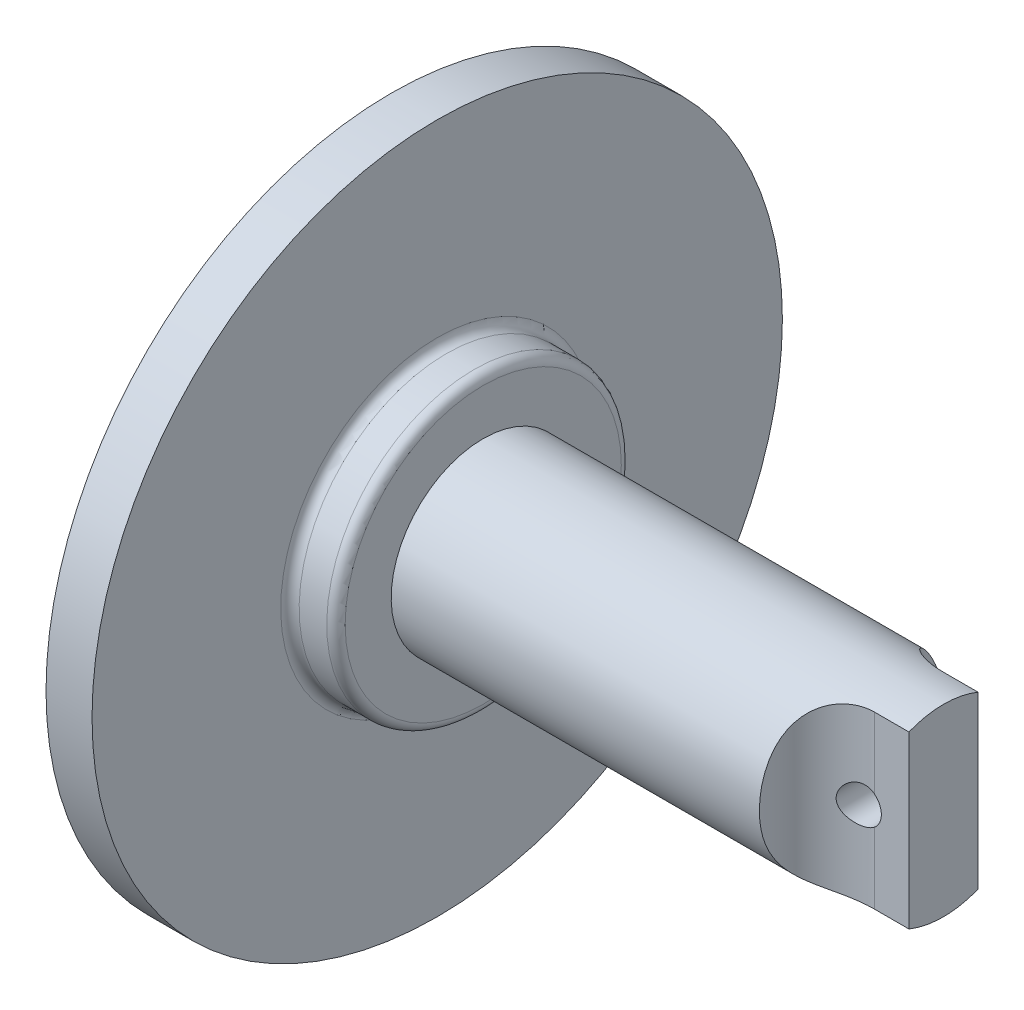
ISO-10303-21;
HEADER;
FILE_DESCRIPTION(('STEP AP214'),'2;1');
FILE_NAME('part.step','',(''),(''),'','','');
FILE_SCHEMA(('AUTOMOTIVE_DESIGN { 1 0 10303 214 1 1 1 1 }'));
ENDSEC;
DATA;
#1=APPLICATION_CONTEXT('core data for automotive mechanical design processes');
#2=APPLICATION_PROTOCOL_DEFINITION('international standard','automotive_design',2000,#1);
#3=PRODUCT_CONTEXT('',#1,'mechanical');
#4=PRODUCT('Part','Part','',(#3));
#5=PRODUCT_RELATED_PRODUCT_CATEGORY('part','',(#4));
#6=PRODUCT_DEFINITION_FORMATION('','',#4);
#7=PRODUCT_DEFINITION_CONTEXT('part definition',#1,'design');
#8=PRODUCT_DEFINITION('design','',#6,#7);
#9=PRODUCT_DEFINITION_SHAPE('','',#8);
#10=(LENGTH_UNIT() NAMED_UNIT(*) SI_UNIT(.MILLI.,.METRE.));
#11=(NAMED_UNIT(*) PLANE_ANGLE_UNIT() SI_UNIT($,.RADIAN.));
#12=(NAMED_UNIT(*) SI_UNIT($,.STERADIAN.) SOLID_ANGLE_UNIT());
#13=UNCERTAINTY_MEASURE_WITH_UNIT(LENGTH_MEASURE(1.E-05),#10,'distance_accuracy_value','');
#14=(GEOMETRIC_REPRESENTATION_CONTEXT(3) GLOBAL_UNCERTAINTY_ASSIGNED_CONTEXT((#13)) GLOBAL_UNIT_ASSIGNED_CONTEXT((#10,
#11,#12)) REPRESENTATION_CONTEXT('',''));
#15=CARTESIAN_POINT('',(0.,0.,0.));
#16=DIRECTION('',(0.,0.,1.));
#17=DIRECTION('',(1.,0.,0.));
#18=AXIS2_PLACEMENT_3D('',#15,#16,#17);
#19=CARTESIAN_POINT('',(0.,0.,0.));
#20=DIRECTION('',(-1.,0.,0.));
#21=DIRECTION('',(0.,-1.,0.));
#22=AXIS2_PLACEMENT_3D('',#19,#20,#21);
#23=PLANE('',#22);
#24=CARTESIAN_POINT('',(0.,0.,0.));
#25=DIRECTION('',(1.,0.,0.));
#26=DIRECTION('',(0.,1.,0.));
#27=AXIS2_PLACEMENT_3D('',#24,#25,#26);
#28=CIRCLE('',#27,75.);
#29=CARTESIAN_POINT('',(0.,75.,0.));
#30=VERTEX_POINT('',#29);
#31=EDGE_CURVE('E184',#30,#30,#28,.T.);
#32=ORIENTED_EDGE('',*,*,#31,.F.);
#33=EDGE_LOOP('',(#32));
#34=FACE_BOUND('',#33,.T.);
#35=ADVANCED_FACE('F34',(#34),#23,.T.);
#36=CARTESIAN_POINT('',(120.,0.,0.));
#37=DIRECTION('',(1.,0.,0.));
#38=DIRECTION('',(0.,1.,0.));
#39=AXIS2_PLACEMENT_3D('',#36,#37,#38);
#40=CYLINDRICAL_SURFACE('',#39,75.);
#41=ORIENTED_EDGE('',*,*,#31,.T.);
#42=EDGE_LOOP('',(#41));
#43=FACE_BOUND('',#42,.T.);
#44=CARTESIAN_POINT('',(10.,0.,0.));
#45=DIRECTION('',(1.,0.,0.));
#46=DIRECTION('',(0.,1.,0.));
#47=AXIS2_PLACEMENT_3D('',#44,#45,#46);
#48=CIRCLE('',#47,75.);
#49=CARTESIAN_POINT('',(10.,75.,0.));
#50=VERTEX_POINT('',#49);
#51=EDGE_CURVE('E182',#50,#50,#48,.T.);
#52=ORIENTED_EDGE('',*,*,#51,.F.);
#53=EDGE_LOOP('',(#52));
#54=FACE_BOUND('',#53,.T.);
#55=ADVANCED_FACE('F220',(#43,#54),#40,.T.);
#56=CARTESIAN_POINT('',(10.,75.,0.));
#57=DIRECTION('',(1.,0.,0.));
#58=DIRECTION('',(0.,1.,0.));
#59=AXIS2_PLACEMENT_3D('',#56,#57,#58);
#60=PLANE('',#59);
#61=ORIENTED_EDGE('',*,*,#51,.T.);
#62=EDGE_LOOP('',(#61));
#63=FACE_BOUND('',#62,.T.);
#64=CARTESIAN_POINT('',(10.,0.,0.));
#65=DIRECTION('',(1.,0.,0.));
#66=DIRECTION('',(0.,1.,0.));
#67=AXIS2_PLACEMENT_3D('',#64,#65,#66);
#68=CIRCLE('',#67,34.);
#69=CARTESIAN_POINT('',(10.,34.,0.));
#70=VERTEX_POINT('',#69);
#71=EDGE_CURVE('E179',#70,#70,#68,.T.);
#72=ORIENTED_EDGE('',*,*,#71,.F.);
#73=EDGE_LOOP('',(#72));
#74=FACE_BOUND('',#73,.T.);
#75=ADVANCED_FACE('F225',(#63,#74),#60,.T.);
#76=CARTESIAN_POINT('',(12.,0.,0.));
#77=DIRECTION('',(1.,0.,0.));
#78=DIRECTION('',(0.,1.,0.));
#79=AXIS2_PLACEMENT_3D('',#76,#77,#78);
#80=TOROIDAL_SURFACE('',#79,34.,2.);
#81=ORIENTED_EDGE('',*,*,#71,.T.);
#82=EDGE_LOOP('',(#81));
#83=FACE_BOUND('',#82,.T.);
#84=CARTESIAN_POINT('',(12.,0.,0.));
#85=DIRECTION('',(1.,0.,0.));
#86=DIRECTION('',(0.,1.,0.));
#87=AXIS2_PLACEMENT_3D('',#84,#85,#86);
#88=CIRCLE('',#87,32.);
#89=CARTESIAN_POINT('',(12.,32.,0.));
#90=VERTEX_POINT('',#89);
#91=EDGE_CURVE('E176',#90,#90,#88,.T.);
#92=ORIENTED_EDGE('',*,*,#91,.F.);
#93=EDGE_LOOP('',(#92));
#94=FACE_BOUND('',#93,.T.);
#95=ADVANCED_FACE('F230',(#83,#94),#80,.F.);
#96=CARTESIAN_POINT('',(120.,0.,0.));
#97=DIRECTION('',(1.,0.,0.));
#98=DIRECTION('',(0.,1.,0.));
#99=AXIS2_PLACEMENT_3D('',#96,#97,#98);
#100=CYLINDRICAL_SURFACE('',#99,32.);
#101=ORIENTED_EDGE('',*,*,#91,.T.);
#102=EDGE_LOOP('',(#101));
#103=FACE_BOUND('',#102,.T.);
#104=CARTESIAN_POINT('',(18.,0.,0.));
#105=DIRECTION('',(1.,0.,0.));
#106=DIRECTION('',(0.,1.,0.));
#107=AXIS2_PLACEMENT_3D('',#104,#105,#106);
#108=CIRCLE('',#107,32.);
#109=CARTESIAN_POINT('',(18.,32.,0.));
#110=VERTEX_POINT('',#109);
#111=EDGE_CURVE('E173',#110,#110,#108,.T.);
#112=ORIENTED_EDGE('',*,*,#111,.F.);
#113=EDGE_LOOP('',(#112));
#114=FACE_BOUND('',#113,.T.);
#115=ADVANCED_FACE('F234',(#103,#114),#100,.T.);
#116=CARTESIAN_POINT('',(18.,0.,0.));
#117=DIRECTION('',(1.,0.,0.));
#118=DIRECTION('',(0.,1.,0.));
#119=AXIS2_PLACEMENT_3D('',#116,#117,#118);
#120=TOROIDAL_SURFACE('',#119,30.,2.);
#121=ORIENTED_EDGE('',*,*,#111,.T.);
#122=EDGE_LOOP('',(#121));
#123=FACE_BOUND('',#122,.T.);
#124=CARTESIAN_POINT('',(20.,0.,0.));
#125=DIRECTION('',(1.,0.,0.));
#126=DIRECTION('',(0.,1.,0.));
#127=AXIS2_PLACEMENT_3D('',#124,#125,#126);
#128=CIRCLE('',#127,30.);
#129=CARTESIAN_POINT('',(20.,30.,0.));
#130=VERTEX_POINT('',#129);
#131=EDGE_CURVE('E170',#130,#130,#128,.T.);
#132=ORIENTED_EDGE('',*,*,#131,.F.);
#133=EDGE_LOOP('',(#132));
#134=FACE_BOUND('',#133,.T.);
#135=ADVANCED_FACE('F237',(#123,#134),#120,.T.);
#136=CARTESIAN_POINT('',(20.,30.,0.));
#137=DIRECTION('',(1.,0.,0.));
#138=DIRECTION('',(0.,1.,0.));
#139=AXIS2_PLACEMENT_3D('',#136,#137,#138);
#140=PLANE('',#139);
#141=ORIENTED_EDGE('',*,*,#131,.T.);
#142=EDGE_LOOP('',(#141));
#143=FACE_BOUND('',#142,.T.);
#144=CARTESIAN_POINT('',(20.,0.,0.));
#145=DIRECTION('',(1.,0.,0.));
#146=DIRECTION('',(0.,1.,0.));
#147=AXIS2_PLACEMENT_3D('',#144,#145,#146);
#148=CIRCLE('',#147,20.);
#149=CARTESIAN_POINT('',(20.,20.,0.));
#150=VERTEX_POINT('',#149);
#151=EDGE_CURVE('E167',#150,#150,#148,.T.);
#152=ORIENTED_EDGE('',*,*,#151,.F.);
#153=EDGE_LOOP('',(#152));
#154=FACE_BOUND('',#153,.T.);
#155=ADVANCED_FACE('F136',(#143,#154),#140,.T.);
#156=CARTESIAN_POINT('',(120.,0.,0.));
#157=DIRECTION('',(1.,0.,0.));
#158=DIRECTION('',(0.,1.,0.));
#159=AXIS2_PLACEMENT_3D('',#156,#157,#158);
#160=CYLINDRICAL_SURFACE('',#159,20.);
#161=DIRECTION('',(1.,0.,0.));
#162=VECTOR('',#161,1.);
#163=CARTESIAN_POINT('',(100.,18.5404962177392,-7.5));
#164=LINE('',#163,#162);
#165=CARTESIAN_POINT('',(112.5,18.5404962177392,-7.5));
#166=VERTEX_POINT('',#165);
#167=CARTESIAN_POINT('',(120.,18.5404962177392,-7.5));
#168=VERTEX_POINT('',#167);
#169=EDGE_CURVE('E193',#166,#168,#164,.T.);
#170=ORIENTED_EDGE('',*,*,#169,.F.);
#171=CARTESIAN_POINT('',(112.5,18.5404962177392,-7.5));
#172=CARTESIAN_POINT('',(112.338956906171,18.5404935091154,-7.49999955027861));
#173=CARTESIAN_POINT('',(112.177932926346,18.5392374224213,-7.50311275273671));
#174=CARTESIAN_POINT('',(111.856167945249,18.5341986988898,-7.51555343832526));
#175=CARTESIAN_POINT('',(111.695426938582,18.53041611075,-7.52488080167958));
#176=CARTESIAN_POINT('',(111.214041205506,18.5152505660081,-7.56216051678758));
#177=CARTESIAN_POINT('',(110.894178375248,18.5000498415969,-7.5994105026875));
#178=CARTESIAN_POINT('',(110.258870229306,18.4590995969255,-7.6983433444966));
#179=CARTESIAN_POINT('',(109.943426376855,18.4333466641446,-7.76003410419078));
#180=CARTESIAN_POINT('',(109.319261373974,18.3706968077058,-7.9072050956589));
#181=CARTESIAN_POINT('',(109.010540014746,18.3338002306962,-7.99268458742403));
#182=CARTESIAN_POINT('',(108.401711680526,18.2480323342663,-8.18660854241349));
#183=CARTESIAN_POINT('',(108.101614800974,18.1991475726731,-8.29507876614651));
#184=CARTESIAN_POINT('',(107.512608040262,18.0885009505557,-8.53366345343799));
#185=CARTESIAN_POINT('',(107.223697897931,18.0267393908767,-8.66377741131189));
#186=CARTESIAN_POINT('',(106.659423660512,17.8893967253437,-8.94392449788416));
#187=CARTESIAN_POINT('',(106.384048770448,17.8138268668637,-9.09394138785777));
#188=CARTESIAN_POINT('',(105.848603776823,17.6478479012738,-9.41199340749333));
#189=CARTESIAN_POINT('',(105.58853329675,17.5574391594321,-9.58002809360115));
#190=CARTESIAN_POINT('',(105.08954204536,17.3624732050346,-9.92893732283396));
#191=CARTESIAN_POINT('',(104.850348448148,17.258166855298,-10.1095619756672));
#192=CARTESIAN_POINT('',(104.389964426535,17.0336543440187,-10.4834222384663));
#193=CARTESIAN_POINT('',(104.168773689014,16.9134484591097,-10.6766576289901));
#194=CARTESIAN_POINT('',(103.745476943824,16.6567016948116,-11.0729404969896));
#195=CARTESIAN_POINT('',(103.543371748361,16.5201601207996,-11.2759883914916));
#196=CARTESIAN_POINT('',(103.158928663785,16.2306073793557,-11.6889245880329));
#197=CARTESIAN_POINT('',(102.976590960287,16.0775960573013,-11.8988129542795));
#198=CARTESIAN_POINT('',(102.63241143685,15.7557535905378,-12.3217950249763));
#199=CARTESIAN_POINT('',(102.470510451821,15.586970694837,-12.5348773809344));
#200=CARTESIAN_POINT('',(102.16633432225,15.2336653435132,-12.9619536808703));
#201=CARTESIAN_POINT('',(102.024058686949,15.0491432816577,-13.1759476019152));
#202=CARTESIAN_POINT('',(101.758442311996,14.6650205230174,-13.6021865636069));
#203=CARTESIAN_POINT('',(101.635104425719,14.4654175607206,-13.8144313361572));
#204=CARTESIAN_POINT('',(101.406350945564,14.0520159789684,-14.2347394953688));
#205=CARTESIAN_POINT('',(101.300938833632,13.8382146127706,-14.4428020627636));
#206=CARTESIAN_POINT('',(101.072966026936,13.3206692533851,-14.9239461252854));
#207=CARTESIAN_POINT('',(100.957203480499,13.0115174546629,-15.1944569601378));
#208=CARTESIAN_POINT('',(100.752274769999,12.3717777884061,-15.7197521143397));
#209=CARTESIAN_POINT('',(100.663116339425,12.0411837217996,-15.9745318438152));
#210=CARTESIAN_POINT('',(100.507319607566,11.3605044367909,-16.465582089206));
#211=CARTESIAN_POINT('',(100.440725701048,11.010382355122,-16.7018154226786));
#212=CARTESIAN_POINT('',(100.326354155674,10.2937035571413,-17.1528138537932));
#213=CARTESIAN_POINT('',(100.278576931776,9.92714647859237,-17.3675784779151));
#214=CARTESIAN_POINT('',(100.187871699835,9.0851446956119,-17.8253801459362));
#215=CARTESIAN_POINT('',(100.149235412189,8.60563205738617,-18.0618046894832));
#216=CARTESIAN_POINT('',(100.088895458415,7.62824928216758,-18.49583605447));
#217=CARTESIAN_POINT('',(100.067197011256,7.13037353649362,-18.6934308974938));
#218=CARTESIAN_POINT('',(100.035028360561,6.12025347659782,-19.0480699174889));
#219=CARTESIAN_POINT('',(100.024554543863,5.60801384056866,-19.2051271309896));
#220=CARTESIAN_POINT('',(100.01017315587,4.57264301175203,-19.4776109589941));
#221=CARTESIAN_POINT('',(100.006263240276,4.04951577508557,-19.5930524250128));
#222=CARTESIAN_POINT('',(100.002612702569,3.23180607381896,-19.7393727233925));
#223=CARTESIAN_POINT('',(100.001789105047,2.93978162092925,-19.7849697937345));
#224=CARTESIAN_POINT('',(100.00068704985,2.3540412350955,-19.8631756809714));
#225=CARTESIAN_POINT('',(100.000408478805,2.06032566667149,-19.8957871978654));
#226=CARTESIAN_POINT('',(100.000080218915,1.47249105338509,-19.9478974534955));
#227=CARTESIAN_POINT('',(100.000029949875,1.17837493354535,-19.9674293241835));
#228=CARTESIAN_POINT('',(100.000000606662,0.589506838491083,-19.9934840044796));
#229=CARTESIAN_POINT('',(100.000021547041,0.294754745599151,-20.0000041543067));
#230=CARTESIAN_POINT('',(100.,0.,-20.));
#231=B_SPLINE_CURVE_WITH_KNOTS('',3,(#171,#172,#173,#174,#175,#176,#177,#178,#179,#180,#181,
#182,#183,#184,#185,#186,#187,#188,#189,#190,#191,#192,#193,#194,#195,#196,#197,#198,#199,#200,
#201,#202,#203,#204,#205,#206,#207,#208,#209,#210,#211,#212,#213,#214,#215,#216,#217,#218,#219,
#220,#221,#222,#223,#224,#225,#226,#227,#228,#229,#230),.UNSPECIFIED.,.F.,.F.,(4,2,2,2,2,2,2,2,
2,2,2,2,2,2,2,2,2,2,2,2,2,2,2,2,2,2,2,2,2,4),(0.,0.483056064645852,0.966102818797453,
1.93203067697302,2.8982711572464,3.86448158351978,4.83178040094929,5.79905662156657,
6.76554844370495,7.73201647863532,8.68294491185735,9.63385680219386,10.584809141404,
11.5357704091961,12.483912186141,13.4320302491328,14.3802910264151,15.3287357862447,
16.6072397737458,17.8861150453493,19.1674920363011,20.4488972834522,22.0547935887148,
23.6611845153705,25.2670581959749,26.8723582157993,27.7588025105291,28.6450623964706,
29.5290687254007,30.4132557393009),.UNSPECIFIED.);
#232=CARTESIAN_POINT('',(100.,0.,-20.));
#233=VERTEX_POINT('',#232);
#234=EDGE_CURVE('E122',#166,#233,#231,.T.);
#235=ORIENTED_EDGE('',*,*,#234,.T.);
#236=CARTESIAN_POINT('',(100.,0.,-20.));
#237=CARTESIAN_POINT('',(100.000013797503,-0.263959994965488,-20.0000025912812));
#238=CARTESIAN_POINT('',(100.00000035709,-0.527917780855497,-19.9947743722892));
#239=CARTESIAN_POINT('',(100.000019298366,-1.05541873460449,-19.9738764115313));
#240=CARTESIAN_POINT('',(100.000051679885,-1.31896190399458,-19.9582067084153));
#241=CARTESIAN_POINT('',(100.000262563184,-1.84522939558049,-19.9164455586537));
#242=CARTESIAN_POINT('',(100.00044106719,-2.1079537052346,-19.8903539531683));
#243=CARTESIAN_POINT('',(100.001147771822,-2.63214767789347,-19.8277960399741));
#244=CARTESIAN_POINT('',(100.001675973136,-2.89361733842707,-19.7913297118396));
#245=CARTESIAN_POINT('',(100.004178156857,-3.67910134172827,-19.6658721356812));
#246=CARTESIAN_POINT('',(100.007074793725,-4.2006887672358,-19.5610995647389));
#247=CARTESIAN_POINT('',(100.01840969438,-5.23375075313772,-19.3103726345516));
#248=CARTESIAN_POINT('',(100.026848045665,-5.74522515372674,-19.1644176251));
#249=CARTESIAN_POINT('',(100.054343593337,-6.78498937818303,-18.822352686095));
#250=CARTESIAN_POINT('',(100.074006172764,-7.31245316173661,-18.6237635554209));
#251=CARTESIAN_POINT('',(100.130750610815,-8.34808369997794,-18.1831323370909));
#252=CARTESIAN_POINT('',(100.167835870034,-8.85624666655375,-17.9410817722405));
#253=CARTESIAN_POINT('',(100.266882824873,-9.84676485885715,-17.41704837384));
#254=CARTESIAN_POINT('',(100.328748263516,-10.3292118538381,-17.13522275603));
#255=CARTESIAN_POINT('',(100.446523793677,-11.0308809337056,-16.6852341110605));
#256=CARTESIAN_POINT('',(100.489939742635,-11.2610823279609,-16.5307126055573));
#257=CARTESIAN_POINT('',(100.586226745268,-11.7135431460163,-16.2132423227072));
#258=CARTESIAN_POINT('',(100.639096558144,-11.9358036074594,-16.0502946532687));
#259=CARTESIAN_POINT('',(100.773164852368,-12.4381614909897,-15.6658967476971));
#260=CARTESIAN_POINT('',(100.858085758998,-12.715231259584,-15.4417573051675));
#261=CARTESIAN_POINT('',(101.048381811694,-13.2529266177377,-14.9828179009289));
#262=CARTESIAN_POINT('',(101.153750876581,-13.5135570658084,-14.7480211245222));
#263=CARTESIAN_POINT('',(101.387167320532,-14.0167332837077,-14.2706472343811));
#264=CARTESIAN_POINT('',(101.515203742604,-14.2592877110252,-14.0280739258681));
#265=CARTESIAN_POINT('',(101.795883679824,-14.7249526777666,-13.5384602974642));
#266=CARTESIAN_POINT('',(101.948527812997,-14.9480627286257,-13.2914198655192));
#267=CARTESIAN_POINT('',(102.281077750524,-15.3752673078448,-12.7948919108993));
#268=CARTESIAN_POINT('',(102.461189432989,-15.579197655327,-12.5454004761948));
#269=CARTESIAN_POINT('',(102.848430503902,-15.9651506877169,-12.0504139568275));
#270=CARTESIAN_POINT('',(103.055560145682,-16.1471731671764,-11.8049189096608));
#271=CARTESIAN_POINT('',(103.496591396988,-16.4888920842588,-11.3227105601211));
#272=CARTESIAN_POINT('',(103.730485963563,-16.6485943707815,-11.0859949691228));
#273=CARTESIAN_POINT('',(104.224055136656,-16.9459096829754,-10.6259671122411));
#274=CARTESIAN_POINT('',(104.483726818057,-17.0835252103629,-10.4026533301621));
#275=CARTESIAN_POINT('',(104.993778973886,-17.3218598642165,-10.0000522104852));
#276=CARTESIAN_POINT('',(105.241409100647,-17.4250332245684,-9.81872113138888));
#277=CARTESIAN_POINT('',(105.753528529321,-17.6157026538585,-9.47238638216087));
#278=CARTESIAN_POINT('',(106.018016481968,-17.703199975344,-9.30738140801238));
#279=CARTESIAN_POINT('',(106.562102391298,-17.863483990226,-8.99592407812314));
#280=CARTESIAN_POINT('',(106.841706842754,-17.9362642957962,-8.84947978877685));
#281=CARTESIAN_POINT('',(107.413856876124,-18.0680772475029,-8.57714897427724));
#282=CARTESIAN_POINT('',(107.706402179412,-18.1271101894592,-8.451262006783));
#283=CARTESIAN_POINT('',(108.294897861687,-18.2311266919519,-8.22442749252778));
#284=CARTESIAN_POINT('',(108.590586044562,-18.2764210146429,-8.12294115166201));
#285=CARTESIAN_POINT('',(109.190167186419,-18.3557315448657,-7.94209538297587));
#286=CARTESIAN_POINT('',(109.494061089491,-18.3897464486392,-7.86273851321117));
#287=CARTESIAN_POINT('',(110.107407235593,-18.4471488260637,-7.72710261918502));
#288=CARTESIAN_POINT('',(110.416849733428,-18.470553335453,-7.67078661546659));
#289=CARTESIAN_POINT('',(111.039562149123,-18.5073299054185,-7.58162798072792));
#290=CARTESIAN_POINT('',(111.352829975712,-18.5207072183469,-7.54877306097011));
#291=CARTESIAN_POINT('',(111.805646829028,-18.532993801756,-7.51852480805441));
#292=CARTESIAN_POINT('',(111.944516975614,-18.5358108310181,-7.51157425852859));
#293=CARTESIAN_POINT('',(112.222253043711,-18.539560079151,-7.5023150426614));
#294=CARTESIAN_POINT('',(112.36111872681,-18.5404947915167,-7.50000023539993));
#295=CARTESIAN_POINT('',(112.5,-18.5404962177391,-7.5));
#296=B_SPLINE_CURVE_WITH_KNOTS('',3,(#236,#237,#238,#239,#240,#241,#242,#243,#244,#245,#246,
#247,#248,#249,#250,#251,#252,#253,#254,#255,#256,#257,#258,#259,#260,#261,#262,#263,#264,#265,
#266,#267,#268,#269,#270,#271,#272,#273,#274,#275,#276,#277,#278,#279,#280,#281,#282,#283,#284,
#285,#286,#287,#288,#289,#290,#291,#292,#293,#294,#295),.UNSPECIFIED.,.F.,.F.,(4,2,2,2,2,2,2,2,
2,2,2,2,2,2,2,2,2,2,2,2,2,2,2,2,2,2,2,2,2,4),(0.,0.791823905445691,1.58364487991398,
2.37547792295786,3.16731252496731,4.76149073414678,6.35569411432771,8.04532243348251,
9.73528067498593,11.4187370771249,12.2603010015413,13.1017545534664,14.19976641651,
15.2974522354423,16.3946088944185,17.4917931129098,18.5976467393321,19.7035107354512,
20.8090843996713,21.9145327495951,22.8847301915757,23.854850078206,24.8253901395612,
25.7959093146275,26.7424777735469,27.68915560571,28.6343080493379,29.5789650654317,
29.9961082194406,30.4126984217148),.UNSPECIFIED.);
#297=CARTESIAN_POINT('',(112.5,-18.5404962177391,-7.5));
#298=VERTEX_POINT('',#297);
#299=EDGE_CURVE('E111',#233,#298,#296,.T.);
#300=ORIENTED_EDGE('',*,*,#299,.T.);
#301=DIRECTION('',(1.,0.,0.));
#302=VECTOR('',#301,1.);
#303=CARTESIAN_POINT('',(100.,-18.5404962177391,-7.5));
#304=LINE('',#303,#302);
#305=CARTESIAN_POINT('',(120.,-18.5404962177391,-7.5));
#306=VERTEX_POINT('',#305);
#307=EDGE_CURVE('E163',#298,#306,#304,.T.);
#308=ORIENTED_EDGE('',*,*,#307,.T.);
#309=CARTESIAN_POINT('',(120.,0.,0.));
#310=DIRECTION('',(1.,0.,0.));
#311=DIRECTION('',(0.,1.,0.));
#312=AXIS2_PLACEMENT_3D('',#309,#310,#311);
#313=CIRCLE('',#312,20.);
#314=CARTESIAN_POINT('',(120.,-18.5404962177391,7.5));
#315=VERTEX_POINT('',#314);
#316=EDGE_CURVE('E155',#315,#306,#313,.T.);
#317=ORIENTED_EDGE('',*,*,#316,.F.);
#318=DIRECTION('',(1.,0.,0.));
#319=VECTOR('',#318,1.);
#320=CARTESIAN_POINT('',(100.,-18.5404962177391,7.5));
#321=LINE('',#320,#319);
#322=CARTESIAN_POINT('',(112.5,-18.5404962177391,7.5));
#323=VERTEX_POINT('',#322);
#324=EDGE_CURVE('E153',#323,#315,#321,.T.);
#325=ORIENTED_EDGE('',*,*,#324,.F.);
#326=CARTESIAN_POINT('',(112.5,-18.5404962177391,7.5));
#327=CARTESIAN_POINT('',(112.338956906171,-18.5404935091154,7.49999955027861));
#328=CARTESIAN_POINT('',(112.177932926346,-18.5392374224213,7.50311275273671));
#329=CARTESIAN_POINT('',(111.856167945249,-18.5341986988898,7.51555343832526));
#330=CARTESIAN_POINT('',(111.695426938582,-18.5304161107499,7.52488080167958));
#331=CARTESIAN_POINT('',(111.214041205506,-18.5152505660081,7.56216051678758));
#332=CARTESIAN_POINT('',(110.894178375248,-18.5000498415969,7.5994105026875));
#333=CARTESIAN_POINT('',(110.258870229306,-18.4590995969255,7.6983433444966));
#334=CARTESIAN_POINT('',(109.943426376855,-18.4333466641446,7.76003410419078));
#335=CARTESIAN_POINT('',(109.319261373974,-18.3706968077058,7.9072050956589));
#336=CARTESIAN_POINT('',(109.010540014746,-18.3338002306961,7.99268458742403));
#337=CARTESIAN_POINT('',(108.401711680526,-18.2480323342663,8.18660854241349));
#338=CARTESIAN_POINT('',(108.101614800974,-18.1991475726731,8.29507876614652));
#339=CARTESIAN_POINT('',(107.512608040262,-18.0885009505557,8.533663453438));
#340=CARTESIAN_POINT('',(107.223697897931,-18.0267393908766,8.6637774113119));
#341=CARTESIAN_POINT('',(106.659423660512,-17.8893967253437,8.94392449788417));
#342=CARTESIAN_POINT('',(106.384048770448,-17.8138268668636,9.09394138785777));
#343=CARTESIAN_POINT('',(105.848603776823,-17.6478479012738,9.41199340749333));
#344=CARTESIAN_POINT('',(105.58853329675,-17.557439159432,9.58002809360116));
#345=CARTESIAN_POINT('',(105.08954204536,-17.3624732050346,9.92893732283397));
#346=CARTESIAN_POINT('',(104.850348448148,-17.258166855298,10.1095619756672));
#347=CARTESIAN_POINT('',(104.389964426535,-17.0336543440187,10.4834222384663));
#348=CARTESIAN_POINT('',(104.168773689014,-16.9134484591097,10.6766576289901));
#349=CARTESIAN_POINT('',(103.745476943824,-16.6567016948116,11.0729404969896));
#350=CARTESIAN_POINT('',(103.543371748361,-16.5201601207995,11.2759883914916));
#351=CARTESIAN_POINT('',(103.158928663785,-16.2306073793557,11.6889245880329));
#352=CARTESIAN_POINT('',(102.976590960287,-16.0775960573013,11.8988129542795));
#353=CARTESIAN_POINT('',(102.63241143685,-15.7557535905378,12.3217950249763));
#354=CARTESIAN_POINT('',(102.470510451821,-15.586970694837,12.5348773809344));
#355=CARTESIAN_POINT('',(102.16633432225,-15.2336653435132,12.9619536808703));
#356=CARTESIAN_POINT('',(102.024058686949,-15.0491432816577,13.1759476019152));
#357=CARTESIAN_POINT('',(101.758442311996,-14.6650205230173,13.6021865636069));
#358=CARTESIAN_POINT('',(101.635104425719,-14.4654175607206,13.8144313361572));
#359=CARTESIAN_POINT('',(101.406350945564,-14.0520159789684,14.2347394953688));
#360=CARTESIAN_POINT('',(101.300938833632,-13.8382146127706,14.4428020627636));
#361=CARTESIAN_POINT('',(101.072966026936,-13.3206692533851,14.9239461252854));
#362=CARTESIAN_POINT('',(100.957203480499,-13.0115174546629,15.1944569601378));
#363=CARTESIAN_POINT('',(100.752274769999,-12.3717777884061,15.7197521143397));
#364=CARTESIAN_POINT('',(100.663116339425,-12.0411837217996,15.9745318438152));
#365=CARTESIAN_POINT('',(100.507319607566,-11.3605044367909,16.465582089206));
#366=CARTESIAN_POINT('',(100.440725701048,-11.010382355122,16.7018154226786));
#367=CARTESIAN_POINT('',(100.326354155674,-10.2937035571412,17.1528138537932));
#368=CARTESIAN_POINT('',(100.278576931776,-9.92714647859234,17.3675784779151));
#369=CARTESIAN_POINT('',(100.187871699835,-9.08514469561187,17.8253801459362));
#370=CARTESIAN_POINT('',(100.149235412189,-8.60563205738615,18.0618046894832));
#371=CARTESIAN_POINT('',(100.088895458415,-7.62824928216756,18.49583605447));
#372=CARTESIAN_POINT('',(100.067197011256,-7.13037353649359,18.6934308974938));
#373=CARTESIAN_POINT('',(100.035028360561,-6.1202534765978,19.0480699174889));
#374=CARTESIAN_POINT('',(100.024554543863,-5.60801384056864,19.2051271309896));
#375=CARTESIAN_POINT('',(100.01017315587,-4.572643011752,19.4776109589941));
#376=CARTESIAN_POINT('',(100.006263240276,-4.04951577508555,19.5930524250128));
#377=CARTESIAN_POINT('',(100.002612702569,-3.23180607381894,19.7393727233925));
#378=CARTESIAN_POINT('',(100.001789105047,-2.93978162092923,19.7849697937345));
#379=CARTESIAN_POINT('',(100.00068704985,-2.35404123509548,19.8631756809714));
#380=CARTESIAN_POINT('',(100.000408478805,-2.06032566667147,19.8957871978654));
#381=CARTESIAN_POINT('',(100.000080218915,-1.47249105338507,19.9478974534955));
#382=CARTESIAN_POINT('',(100.000029949875,-1.17837493354533,19.9674293241835));
#383=CARTESIAN_POINT('',(100.000000606662,-0.589506838491056,19.9934840044796));
#384=CARTESIAN_POINT('',(100.000021547041,-0.294754745599125,20.0000041543067));
#385=CARTESIAN_POINT('',(100.,0.,20.));
#386=B_SPLINE_CURVE_WITH_KNOTS('',3,(#326,#327,#328,#329,#330,#331,#332,#333,#334,#335,#336,
#337,#338,#339,#340,#341,#342,#343,#344,#345,#346,#347,#348,#349,#350,#351,#352,#353,#354,#355,
#356,#357,#358,#359,#360,#361,#362,#363,#364,#365,#366,#367,#368,#369,#370,#371,#372,#373,#374,
#375,#376,#377,#378,#379,#380,#381,#382,#383,#384,#385),.UNSPECIFIED.,.F.,.F.,(4,2,2,2,2,2,2,2,
2,2,2,2,2,2,2,2,2,2,2,2,2,2,2,2,2,2,2,2,2,4),(0.,0.483056064645852,0.966102818797439,
1.93203067697302,2.89827115724637,3.86448158351978,4.83178040094931,5.79905662156661,
6.76554844370497,7.73201647863533,8.68294491185736,9.63385680219387,10.584809141404,
11.5357704091961,12.483912186141,13.4320302491328,14.3802910264151,15.3287357862447,
16.6072397737458,17.8861150453493,19.1674920363011,20.4488972834522,22.0547935887148,
23.6611845153704,25.2670581959749,26.8723582157993,27.7588025105291,28.6450623964706,
29.5290687254007,30.4132557393009),.UNSPECIFIED.);
#387=CARTESIAN_POINT('',(100.,0.,20.));
#388=VERTEX_POINT('',#387);
#389=EDGE_CURVE('E47',#323,#388,#386,.T.);
#390=ORIENTED_EDGE('',*,*,#389,.T.);
#391=CARTESIAN_POINT('',(100.,0.,20.));
#392=CARTESIAN_POINT('',(100.000013797503,0.263959994965514,20.0000025912812));
#393=CARTESIAN_POINT('',(100.00000035709,0.527917780855522,19.9947743722892));
#394=CARTESIAN_POINT('',(100.000019298366,1.05541873460451,19.9738764115313));
#395=CARTESIAN_POINT('',(100.000051679885,1.3189619039946,19.9582067084153));
#396=CARTESIAN_POINT('',(100.000262563184,1.84522939558052,19.9164455586537));
#397=CARTESIAN_POINT('',(100.00044106719,2.10795370523462,19.8903539531683));
#398=CARTESIAN_POINT('',(100.001147771822,2.6321476778935,19.8277960399741));
#399=CARTESIAN_POINT('',(100.001675973136,2.89361733842709,19.7913297118396));
#400=CARTESIAN_POINT('',(100.004178156857,3.67910134172829,19.6658721356812));
#401=CARTESIAN_POINT('',(100.007074793725,4.20068876723582,19.5610995647389));
#402=CARTESIAN_POINT('',(100.01840969438,5.23375075313774,19.3103726345516));
#403=CARTESIAN_POINT('',(100.026848045665,5.74522515372676,19.1644176251));
#404=CARTESIAN_POINT('',(100.054343593337,6.78498937818305,18.822352686095));
#405=CARTESIAN_POINT('',(100.074006172764,7.31245316173663,18.6237635554209));
#406=CARTESIAN_POINT('',(100.130750610815,8.34808369997796,18.1831323370909));
#407=CARTESIAN_POINT('',(100.167835870034,8.85624666655377,17.9410817722404));
#408=CARTESIAN_POINT('',(100.266882824873,9.84676485885717,17.41704837384));
#409=CARTESIAN_POINT('',(100.328748263516,10.3292118538382,17.13522275603));
#410=CARTESIAN_POINT('',(100.446523793677,11.0308809337057,16.6852341110605));
#411=CARTESIAN_POINT('',(100.489939742635,11.2610823279609,16.5307126055573));
#412=CARTESIAN_POINT('',(100.586226745268,11.7135431460163,16.2132423227072));
#413=CARTESIAN_POINT('',(100.639096558144,11.9358036074594,16.0502946532687));
#414=CARTESIAN_POINT('',(100.773164852368,12.4381614909897,15.6658967476971));
#415=CARTESIAN_POINT('',(100.858085758998,12.715231259584,15.4417573051675));
#416=CARTESIAN_POINT('',(101.048381811694,13.2529266177377,14.9828179009289));
#417=CARTESIAN_POINT('',(101.153750876581,13.5135570658084,14.7480211245222));
#418=CARTESIAN_POINT('',(101.387167320532,14.0167332837077,14.2706472343811));
#419=CARTESIAN_POINT('',(101.515203742604,14.2592877110253,14.0280739258681));
#420=CARTESIAN_POINT('',(101.795883679824,14.7249526777666,13.5384602974642));
#421=CARTESIAN_POINT('',(101.948527812997,14.9480627286257,13.2914198655192));
#422=CARTESIAN_POINT('',(102.281077750524,15.3752673078448,12.7948919108993));
#423=CARTESIAN_POINT('',(102.461189432989,15.579197655327,12.5454004761948));
#424=CARTESIAN_POINT('',(102.848430503902,15.9651506877169,12.0504139568275));
#425=CARTESIAN_POINT('',(103.055560145682,16.1471731671764,11.8049189096608));
#426=CARTESIAN_POINT('',(103.496591396988,16.4888920842588,11.3227105601211));
#427=CARTESIAN_POINT('',(103.730485963563,16.6485943707815,11.0859949691228));
#428=CARTESIAN_POINT('',(104.224055136656,16.9459096829754,10.6259671122411));
#429=CARTESIAN_POINT('',(104.483726818057,17.0835252103629,10.4026533301621));
#430=CARTESIAN_POINT('',(104.993778973886,17.3218598642166,10.0000522104852));
#431=CARTESIAN_POINT('',(105.241409100647,17.4250332245684,9.81872113138887));
#432=CARTESIAN_POINT('',(105.753528529321,17.6157026538585,9.47238638216086));
#433=CARTESIAN_POINT('',(106.018016481968,17.703199975344,9.30738140801237));
#434=CARTESIAN_POINT('',(106.562102391297,17.863483990226,8.99592407812314));
#435=CARTESIAN_POINT('',(106.841706842754,17.9362642957962,8.84947978877685));
#436=CARTESIAN_POINT('',(107.413856876124,18.068077247503,8.57714897427724));
#437=CARTESIAN_POINT('',(107.706402179412,18.1271101894592,8.451262006783));
#438=CARTESIAN_POINT('',(108.294897861687,18.2311266919519,8.22442749252778));
#439=CARTESIAN_POINT('',(108.590586044562,18.2764210146429,8.12294115166201));
#440=CARTESIAN_POINT('',(109.190167186419,18.3557315448657,7.94209538297587));
#441=CARTESIAN_POINT('',(109.494061089491,18.3897464486393,7.86273851321118));
#442=CARTESIAN_POINT('',(110.107407235593,18.4471488260637,7.72710261918502));
#443=CARTESIAN_POINT('',(110.416849733428,18.470553335453,7.67078661546659));
#444=CARTESIAN_POINT('',(111.039562149123,18.5073299054185,7.58162798072792));
#445=CARTESIAN_POINT('',(111.352829975712,18.5207072183469,7.54877306097011));
#446=CARTESIAN_POINT('',(111.805646829028,18.532993801756,7.51852480805441));
#447=CARTESIAN_POINT('',(111.944516975614,18.5358108310181,7.51157425852859));
#448=CARTESIAN_POINT('',(112.222253043711,18.539560079151,7.5023150426614));
#449=CARTESIAN_POINT('',(112.36111872681,18.5404947915168,7.50000023539993));
#450=CARTESIAN_POINT('',(112.5,18.5404962177392,7.5));
#451=B_SPLINE_CURVE_WITH_KNOTS('',3,(#391,#392,#393,#394,#395,#396,#397,#398,#399,#400,#401,
#402,#403,#404,#405,#406,#407,#408,#409,#410,#411,#412,#413,#414,#415,#416,#417,#418,#419,#420,
#421,#422,#423,#424,#425,#426,#427,#428,#429,#430,#431,#432,#433,#434,#435,#436,#437,#438,#439,
#440,#441,#442,#443,#444,#445,#446,#447,#448,#449,#450),.UNSPECIFIED.,.F.,.F.,(4,2,2,2,2,2,2,2,
2,2,2,2,2,2,2,2,2,2,2,2,2,2,2,2,2,2,2,2,2,4),(0.,0.791823905445689,1.58364487991398,
2.37547792295786,3.16731252496731,4.76149073414678,6.35569411432771,8.04532243348251,
9.73528067498593,11.4187370771249,12.2603010015413,13.1017545534664,14.19976641651,
15.2974522354423,16.3946088944185,17.4917931129098,18.5976467393321,19.7035107354512,
20.8090843996712,21.9145327495951,22.8847301915757,23.854850078206,24.8253901395612,
25.7959093146275,26.7424777735469,27.68915560571,28.6343080493379,29.5789650654317,
29.9961082194406,30.4126984217148),.UNSPECIFIED.);
#452=CARTESIAN_POINT('',(112.5,18.5404962177392,7.5));
#453=VERTEX_POINT('',#452);
#454=EDGE_CURVE('E143',#388,#453,#451,.T.);
#455=ORIENTED_EDGE('',*,*,#454,.T.);
#456=DIRECTION('',(1.,0.,0.));
#457=VECTOR('',#456,1.);
#458=CARTESIAN_POINT('',(100.,18.5404962177392,7.5));
#459=LINE('',#458,#457);
#460=CARTESIAN_POINT('',(120.,18.5404962177392,7.5));
#461=VERTEX_POINT('',#460);
#462=EDGE_CURVE('E158',#453,#461,#459,.T.);
#463=ORIENTED_EDGE('',*,*,#462,.T.);
#464=EDGE_CURVE('E161',#168,#461,#313,.T.);
#465=ORIENTED_EDGE('',*,*,#464,.F.);
#466=EDGE_LOOP('',(#170,#235,#300,#308,#317,#325,#390,#455,#463,#465));
#467=FACE_BOUND('',#466,.T.);
#468=ORIENTED_EDGE('',*,*,#151,.T.);
#469=EDGE_LOOP('',(#468));
#470=FACE_BOUND('',#469,.T.);
#471=ADVANCED_FACE('F130',(#467,#470),#160,.T.);
#472=CARTESIAN_POINT('',(120.,0.,0.));
#473=DIRECTION('',(1.,0.,0.));
#474=DIRECTION('',(0.,1.,0.));
#475=AXIS2_PLACEMENT_3D('',#472,#473,#474);
#476=PLANE('',#475);
#477=DIRECTION('',(0.,-1.,0.));
#478=VECTOR('',#477,1.);
#479=CARTESIAN_POINT('',(120.,18.5404962177392,-7.5));
#480=LINE('',#479,#478);
#481=EDGE_CURVE('E200',#168,#306,#480,.T.);
#482=ORIENTED_EDGE('',*,*,#481,.F.);
#483=ORIENTED_EDGE('',*,*,#464,.T.);
#484=DIRECTION('',(0.,1.,0.));
#485=VECTOR('',#484,1.);
#486=CARTESIAN_POINT('',(120.,18.5404962177392,7.5));
#487=LINE('',#486,#485);
#488=EDGE_CURVE('E159',#315,#461,#487,.T.);
#489=ORIENTED_EDGE('',*,*,#488,.F.);
#490=ORIENTED_EDGE('',*,*,#316,.T.);
#491=EDGE_LOOP('',(#482,#483,#489,#490));
#492=FACE_BOUND('',#491,.T.);
#493=ADVANCED_FACE('F135',(#492),#476,.T.);
#494=CARTESIAN_POINT('',(100.,18.5404962177392,7.5));
#495=DIRECTION('',(0.,0.,-1.));
#496=DIRECTION('',(-1.,0.,0.));
#497=AXIS2_PLACEMENT_3D('',#494,#495,#496);
#498=PLANE('',#497);
#499=DIRECTION('',(0.,1.,0.));
#500=VECTOR('',#499,1.);
#501=CARTESIAN_POINT('',(112.5,18.5404962177392,7.5));
#502=LINE('',#501,#500);
#503=CARTESIAN_POINT('',(112.5,3.12249899919922,7.5));
#504=VERTEX_POINT('',#503);
#505=EDGE_CURVE('E104',#453,#504,#502,.F.);
#506=ORIENTED_EDGE('',*,*,#505,.T.);
#507=CARTESIAN_POINT('',(110.,0.,7.50000000000001));
#508=DIRECTION('',(0.,0.,-1.));
#509=DIRECTION('',(-1.,0.,0.));
#510=AXIS2_PLACEMENT_3D('',#507,#508,#509);
#511=CIRCLE('',#510,4.00000000000001);
#512=CARTESIAN_POINT('',(112.5,-3.12249899919922,7.5));
#513=VERTEX_POINT('',#512);
#514=EDGE_CURVE('E60',#504,#513,#511,.T.);
#515=ORIENTED_EDGE('',*,*,#514,.T.);
#516=EDGE_CURVE('E101',#513,#323,#502,.F.);
#517=ORIENTED_EDGE('',*,*,#516,.T.);
#518=ORIENTED_EDGE('',*,*,#324,.T.);
#519=ORIENTED_EDGE('',*,*,#488,.T.);
#520=ORIENTED_EDGE('',*,*,#462,.F.);
#521=EDGE_LOOP('',(#506,#515,#517,#518,#519,#520));
#522=FACE_BOUND('',#521,.T.);
#523=ADVANCED_FACE('F100',(#522),#498,.F.);
#524=CARTESIAN_POINT('',(100.,18.5404962177392,-7.5));
#525=DIRECTION('',(0.,0.,1.));
#526=DIRECTION('',(1.,0.,0.));
#527=AXIS2_PLACEMENT_3D('',#524,#525,#526);
#528=PLANE('',#527);
#529=DIRECTION('',(0.,-1.,0.));
#530=VECTOR('',#529,1.);
#531=CARTESIAN_POINT('',(112.5,18.5404962177392,-7.5));
#532=LINE('',#531,#530);
#533=CARTESIAN_POINT('',(112.5,-3.12249899919922,-7.5));
#534=VERTEX_POINT('',#533);
#535=EDGE_CURVE('E109',#298,#534,#532,.F.);
#536=ORIENTED_EDGE('',*,*,#535,.T.);
#537=CARTESIAN_POINT('',(110.,0.,-7.50000000000001));
#538=DIRECTION('',(0.,0.,1.));
#539=DIRECTION('',(1.,0.,0.));
#540=AXIS2_PLACEMENT_3D('',#537,#538,#539);
#541=CIRCLE('',#540,4.00000000000001);
#542=CARTESIAN_POINT('',(112.5,3.12249899919922,-7.5));
#543=VERTEX_POINT('',#542);
#544=EDGE_CURVE('E53',#534,#543,#541,.T.);
#545=ORIENTED_EDGE('',*,*,#544,.T.);
#546=EDGE_CURVE('E113',#543,#166,#532,.F.);
#547=ORIENTED_EDGE('',*,*,#546,.T.);
#548=ORIENTED_EDGE('',*,*,#169,.T.);
#549=ORIENTED_EDGE('',*,*,#481,.T.);
#550=ORIENTED_EDGE('',*,*,#307,.F.);
#551=EDGE_LOOP('',(#536,#545,#547,#548,#549,#550));
#552=FACE_BOUND('',#551,.T.);
#553=ADVANCED_FACE('F191',(#552),#528,.F.);
#554=CARTESIAN_POINT('',(112.5,0.,-20.));
#555=DIRECTION('',(0.,-1.,0.));
#556=DIRECTION('',(1.,0.,0.));
#557=AXIS2_PLACEMENT_3D('',#554,#555,#556);
#558=CYLINDRICAL_SURFACE('',#557,12.5);
#559=ORIENTED_EDGE('',*,*,#546,.F.);
#560=CARTESIAN_POINT('',(112.5,3.12249899919922,-7.5));
#561=CARTESIAN_POINT('',(112.415053644146,3.19052764093272,-7.49999367301154));
#562=CARTESIAN_POINT('',(112.32731194975,3.25507120572875,-7.5008655071381));
#563=CARTESIAN_POINT('',(112.146891174834,3.37678422070121,-7.50466435136988));
#564=CARTESIAN_POINT('',(112.05421184198,3.43395329349596,-7.50759146660255));
#565=CARTESIAN_POINT('',(111.86467572965,3.54045135484502,-7.5157955542898));
#566=CARTESIAN_POINT('',(111.767823358725,3.58978837121487,-7.52107009926528));
#567=CARTESIAN_POINT('',(111.570576864993,3.68036182988266,-7.5342092932599));
#568=CARTESIAN_POINT('',(111.470182922787,3.72159868454134,-7.54207381037489));
#569=CARTESIAN_POINT('',(111.266515241243,3.79574680223439,-7.56058768116756));
#570=CARTESIAN_POINT('',(111.163239076568,3.82865080351761,-7.57123944750081));
#571=CARTESIAN_POINT('',(110.954640043811,3.88591905062432,-7.59544866627387));
#572=CARTESIAN_POINT('',(110.849316434961,3.91028014255251,-7.60900718886776));
#573=CARTESIAN_POINT('',(110.637526679266,3.95033672846299,-7.63906907188678));
#574=CARTESIAN_POINT('',(110.531061447514,3.96603870093988,-7.6555702184625));
#575=CARTESIAN_POINT('',(110.317689956531,3.98881020203638,-7.69149618080684));
#576=CARTESIAN_POINT('',(110.210783547293,3.99587650099568,-7.71092208735925));
#577=CARTESIAN_POINT('',(109.891060420683,4.00417402753908,-7.77337788613008));
#578=CARTESIAN_POINT('',(109.678597967942,3.99262311381171,-7.82067640147183));
#579=CARTESIAN_POINT('',(109.260610732629,3.93673511510613,-7.92511140815322));
#580=CARTESIAN_POINT('',(109.05508923988,3.89238270498923,-7.98225248844755));
#581=CARTESIAN_POINT('',(108.645549445946,3.77006098830673,-8.10709238029328));
#582=CARTESIAN_POINT('',(108.442115526726,3.69052779326852,-8.17517521515738));
#583=CARTESIAN_POINT('',(108.052162455059,3.50043272407936,-8.31625840999134));
#584=CARTESIAN_POINT('',(107.865648827694,3.38986076257056,-8.389260362765));
#585=CARTESIAN_POINT('',(107.499893627068,3.13103398405926,-8.54176846509444));
#586=CARTESIAN_POINT('',(107.322240248428,2.98057872711737,-8.62135259258727));
#587=CARTESIAN_POINT('',(106.994555678123,2.64980237903977,-8.77623269501797));
#588=CARTESIAN_POINT('',(106.844539080492,2.46946560342498,-8.85152638991421));
#589=CARTESIAN_POINT('',(106.643080022432,2.17836368608006,-8.95679571667592));
#590=CARTESIAN_POINT('',(106.579544432649,2.07722360222612,-8.99078817345294));
#591=CARTESIAN_POINT('',(106.461370040925,1.86880334337679,-9.05516269241829));
#592=CARTESIAN_POINT('',(106.406726816042,1.76152625695162,-9.08554654743182));
#593=CARTESIAN_POINT('',(106.307021256556,1.54158331661588,-9.14180975340843));
#594=CARTESIAN_POINT('',(106.261951151588,1.42892192477288,-9.16769275453261));
#595=CARTESIAN_POINT('',(106.181983961694,1.19898283586176,-9.21413816105136));
#596=CARTESIAN_POINT('',(106.147085085993,1.08170595554126,-9.23470150296809));
#597=CARTESIAN_POINT('',(106.091374405491,0.857025427107513,-9.2677847094945));
#598=CARTESIAN_POINT('',(106.069417820458,0.749999774011311,-9.28095012757259));
#599=CARTESIAN_POINT('',(106.034297877169,0.534015108071772,-9.30209744673382));
#600=CARTESIAN_POINT('',(106.021133265646,0.42505637305684,-9.31008008659999));
#601=CARTESIAN_POINT('',(106.003813348472,0.206230801450449,-9.32059634823854));
#602=CARTESIAN_POINT('',(105.999652422609,0.0963645743502131,-9.32313336922534));
#603=CARTESIAN_POINT('',(106.000392991863,-0.123320642698242,-9.32268247915672));
#604=CARTESIAN_POINT('',(106.005293821253,-0.233139635523713,-9.31969497396496));
#605=CARTESIAN_POINT('',(106.022997132273,-0.439179542938828,-9.30895114467359));
#606=CARTESIAN_POINT('',(106.034829243063,-0.535515913520672,-9.30178085152055));
#607=CARTESIAN_POINT('',(106.065374108908,-0.726709474041811,-9.28338208541387));
#608=CARTESIAN_POINT('',(106.084089119883,-0.821566168368742,-9.27215228194668));
#609=CARTESIAN_POINT('',(106.150248637532,-1.10292840329844,-9.23276489681813));
#610=CARTESIAN_POINT('',(106.207722085291,-1.28638935782258,-9.1989001471561));
#611=CARTESIAN_POINT('',(106.349252677508,-1.64642793820392,-9.11767011770383));
#612=CARTESIAN_POINT('',(106.434099144648,-1.82259946585753,-9.06990873686041));
#613=CARTESIAN_POINT('',(106.626956325593,-2.15873810209542,-8.96508264690425));
#614=CARTESIAN_POINT('',(106.734976874127,-2.31869828826423,-8.90801399039901));
#615=CARTESIAN_POINT('',(106.987052184053,-2.63990070775221,-8.78038239242723));
#616=CARTESIAN_POINT('',(107.133969949485,-2.79858527977528,-8.70903036819475));
#617=CARTESIAN_POINT('',(107.450688540015,-3.0898845050934,-8.56387872018118));
#618=CARTESIAN_POINT('',(107.620502516959,-3.222484066411,-8.49007770817827));
#619=CARTESIAN_POINT('',(107.996976844804,-3.47034100550156,-8.33733917773629));
#620=CARTESIAN_POINT('',(108.205603875748,-3.58276477504177,-8.25857753173819));
#621=CARTESIAN_POINT('',(108.532358136062,-3.7229201263922,-8.14583513051953));
#622=CARTESIAN_POINT('',(108.643646758515,-3.76490786085654,-8.10913471471678));
#623=CARTESIAN_POINT('',(108.870173103508,-3.83896670035007,-8.03804350291115));
#624=CARTESIAN_POINT('',(108.985408942921,-3.87104246292734,-8.00365162811035));
#625=CARTESIAN_POINT('',(109.216914519677,-3.92436411025224,-7.93826037211495));
#626=CARTESIAN_POINT('',(109.333127052745,-3.94579687388479,-7.90721055095615));
#627=CARTESIAN_POINT('',(109.567715070254,-3.9783341174341,-7.84819679007028));
#628=CARTESIAN_POINT('',(109.686089573585,-3.98944316909832,-7.8202314892358));
#629=CARTESIAN_POINT('',(109.924074009522,-4.00105290926115,-7.76768823479835));
#630=CARTESIAN_POINT('',(110.04368359014,-4.00155654105287,-7.74310934325579));
#631=CARTESIAN_POINT('',(110.283142064576,-3.99176473311578,-7.69754535725928));
#632=CARTESIAN_POINT('',(110.40299093512,-3.98147029699362,-7.67655992902832));
#633=CARTESIAN_POINT('',(110.632714279055,-3.95120888998781,-7.63975211059097));
#634=CARTESIAN_POINT('',(110.742651102978,-3.93204117820456,-7.62365772246894));
#635=CARTESIAN_POINT('',(110.960927574488,-3.88446825311207,-7.59462307839779));
#636=CARTESIAN_POINT('',(111.069267320421,-3.85606361110386,-7.58168262746529));
#637=CARTESIAN_POINT('',(111.283434531246,-3.79016382471789,-7.55887625821641));
#638=CARTESIAN_POINT('',(111.389262907742,-3.75267203607323,-7.5490092080105));
#639=CARTESIAN_POINT('',(111.597555430695,-3.66884507365282,-7.53218063595558));
#640=CARTESIAN_POINT('',(111.700020468164,-3.62251226455883,-7.52521833876391));
#641=CARTESIAN_POINT('',(111.924381618274,-3.50941558302623,-7.51264489788062));
#642=CARTESIAN_POINT('',(112.045193130658,-3.44040878114454,-7.50773452355622));
#643=CARTESIAN_POINT('',(112.278854673351,-3.29031260169413,-7.50140538361342));
#644=CARTESIAN_POINT('',(112.391718552879,-3.2092450488983,-7.49998039055125));
#645=CARTESIAN_POINT('',(112.5,-3.12249899919922,-7.5));
#646=B_SPLINE_CURVE_WITH_KNOTS('',3,(#560,#561,#562,#563,#564,#565,#566,#567,#568,#569,#570,
#571,#572,#573,#574,#575,#576,#577,#578,#579,#580,#581,#582,#583,#584,#585,#586,#587,#588,#589,
#590,#591,#592,#593,#594,#595,#596,#597,#598,#599,#600,#601,#602,#603,#604,#605,#606,#607,#608,
#609,#610,#611,#612,#613,#614,#615,#616,#617,#618,#619,#620,#621,#622,#623,#624,#625,#626,#627,
#628,#629,#630,#631,#632,#633,#634,#635,#636,#637,#638,#639,#640,#641,#642,#643,#644,#645),
.UNSPECIFIED.,.F.,.F.,(4,2,2,2,2,2,2,2,2,2,2,2,2,2,2,2,2,2,2,2,2,2,2,2,2,2,2,2,2,2,2,2,2,2,2,2,
2,2,2,2,2,2,4),(0.,0.326398660010025,0.652814016498825,0.978892608080393,1.30495459544072,
1.63129976259647,1.95776528425364,2.28398622163031,2.61032912525594,3.26106217007254,
3.91209943513189,4.59555306695288,5.27922907356058,6.01405752861207,6.74927291596048,
7.12139496580747,7.49333135771099,7.86496469058306,8.23653255308374,8.56619913861095,
8.89581872124333,9.22523249184758,9.55462206277051,9.84624613911538,10.1379658826898,
10.7209189179072,11.3224627702156,11.9242624153584,12.6046089066715,13.2853478750766,
14.0305871090667,14.4036377410672,14.7765128123788,15.1425861234932,15.508497245526,
15.874306815909,16.2400823898034,16.5779065549012,16.9157098296606,17.2533885488055,
17.5909770762952,18.0078079964645,18.4238936054808),.UNSPECIFIED.);
#647=EDGE_CURVE('E105',#543,#534,#646,.T.);
#648=ORIENTED_EDGE('',*,*,#647,.T.);
#649=ORIENTED_EDGE('',*,*,#535,.F.);
#650=ORIENTED_EDGE('',*,*,#299,.F.);
#651=ORIENTED_EDGE('',*,*,#234,.F.);
#652=EDGE_LOOP('',(#559,#648,#649,#650,#651));
#653=FACE_BOUND('',#652,.T.);
#654=ADVANCED_FACE('F127',(#653),#558,.F.);
#655=CARTESIAN_POINT('',(112.5,0.,20.));
#656=DIRECTION('',(0.,1.,0.));
#657=DIRECTION('',(-1.,0.,0.));
#658=AXIS2_PLACEMENT_3D('',#655,#656,#657);
#659=CYLINDRICAL_SURFACE('',#658,12.5);
#660=ORIENTED_EDGE('',*,*,#516,.F.);
#661=CARTESIAN_POINT('',(112.5,-3.12249899919922,7.5));
#662=CARTESIAN_POINT('',(112.415053644146,-3.19052764093271,7.49999367301154));
#663=CARTESIAN_POINT('',(112.32731194975,-3.25507120572875,7.5008655071381));
#664=CARTESIAN_POINT('',(112.146891174834,-3.37678422070121,7.50466435136988));
#665=CARTESIAN_POINT('',(112.05421184198,-3.43395329349596,7.50759146660255));
#666=CARTESIAN_POINT('',(111.86467572965,-3.54045135484502,7.5157955542898));
#667=CARTESIAN_POINT('',(111.767823358725,-3.58978837121488,7.52107009926528));
#668=CARTESIAN_POINT('',(111.570576864993,-3.68036182988266,7.5342092932599));
#669=CARTESIAN_POINT('',(111.470182922787,-3.72159868454134,7.54207381037489));
#670=CARTESIAN_POINT('',(111.266515241243,-3.79574680223439,7.56058768116756));
#671=CARTESIAN_POINT('',(111.163239076568,-3.82865080351761,7.5712394475008));
#672=CARTESIAN_POINT('',(110.954640043811,-3.88591905062432,7.59544866627387));
#673=CARTESIAN_POINT('',(110.849316434961,-3.91028014255251,7.60900718886777));
#674=CARTESIAN_POINT('',(110.637526679266,-3.95033672846299,7.63906907188678));
#675=CARTESIAN_POINT('',(110.531061447514,-3.96603870093988,7.6555702184625));
#676=CARTESIAN_POINT('',(110.317689956531,-3.98881020203638,7.69149618080684));
#677=CARTESIAN_POINT('',(110.210783547293,-3.99587650099568,7.71092208735925));
#678=CARTESIAN_POINT('',(109.891060420683,-4.00417402753908,7.77337788613008));
#679=CARTESIAN_POINT('',(109.678597967942,-3.99262311381171,7.82067640147183));
#680=CARTESIAN_POINT('',(109.260610732629,-3.93673511510613,7.92511140815322));
#681=CARTESIAN_POINT('',(109.05508923988,-3.89238270498923,7.98225248844755));
#682=CARTESIAN_POINT('',(108.645549445946,-3.77006098830673,8.10709238029328));
#683=CARTESIAN_POINT('',(108.442115526726,-3.69052779326852,8.17517521515738));
#684=CARTESIAN_POINT('',(108.052162455059,-3.50043272407936,8.31625840999134));
#685=CARTESIAN_POINT('',(107.865648827694,-3.38986076257056,8.389260362765));
#686=CARTESIAN_POINT('',(107.499893627068,-3.13103398405926,8.54176846509444));
#687=CARTESIAN_POINT('',(107.322240248428,-2.98057872711737,8.62135259258727));
#688=CARTESIAN_POINT('',(106.994555678123,-2.64980237903977,8.77623269501797));
#689=CARTESIAN_POINT('',(106.844539080492,-2.46946560342497,8.85152638991421));
#690=CARTESIAN_POINT('',(106.643080022432,-2.17836368608006,8.95679571667592));
#691=CARTESIAN_POINT('',(106.579544432649,-2.07722360222612,8.99078817345294));
#692=CARTESIAN_POINT('',(106.461370040925,-1.86880334337679,9.05516269241829));
#693=CARTESIAN_POINT('',(106.406726816042,-1.76152625695162,9.08554654743182));
#694=CARTESIAN_POINT('',(106.307021256556,-1.54158331661588,9.14180975340843));
#695=CARTESIAN_POINT('',(106.261951151588,-1.42892192477288,9.16769275453261));
#696=CARTESIAN_POINT('',(106.181983961694,-1.19898283586176,9.21413816105136));
#697=CARTESIAN_POINT('',(106.147085085993,-1.08170595554126,9.23470150296809));
#698=CARTESIAN_POINT('',(106.091374405491,-0.857025427107514,9.2677847094945));
#699=CARTESIAN_POINT('',(106.069417820458,-0.749999774011311,9.28095012757259));
#700=CARTESIAN_POINT('',(106.034297877169,-0.534015108071773,9.30209744673382));
#701=CARTESIAN_POINT('',(106.021133265646,-0.425056373056841,9.31008008659999));
#702=CARTESIAN_POINT('',(106.003813348472,-0.206230801450449,9.32059634823854));
#703=CARTESIAN_POINT('',(105.999652422609,-0.0963645743502139,9.32313336922534));
#704=CARTESIAN_POINT('',(106.000392991863,0.123320642698241,9.32268247915672));
#705=CARTESIAN_POINT('',(106.005293821253,0.233139635523712,9.31969497396496));
#706=CARTESIAN_POINT('',(106.022997132273,0.439179542938827,9.30895114467359));
#707=CARTESIAN_POINT('',(106.034829243063,0.53551591352067,9.30178085152055));
#708=CARTESIAN_POINT('',(106.065374108908,0.72670947404181,9.28338208541387));
#709=CARTESIAN_POINT('',(106.084089119883,0.821566168368741,9.27215228194668));
#710=CARTESIAN_POINT('',(106.150248637532,1.10292840329844,9.23276489681813));
#711=CARTESIAN_POINT('',(106.207722085291,1.28638935782258,9.1989001471561));
#712=CARTESIAN_POINT('',(106.349252677508,1.64642793820392,9.11767011770383));
#713=CARTESIAN_POINT('',(106.434099144648,1.82259946585753,9.06990873686041));
#714=CARTESIAN_POINT('',(106.626956325593,2.15873810209542,8.96508264690425));
#715=CARTESIAN_POINT('',(106.734976874127,2.31869828826423,8.90801399039901));
#716=CARTESIAN_POINT('',(106.987052184053,2.63990070775221,8.78038239242723));
#717=CARTESIAN_POINT('',(107.133969949485,2.79858527977528,8.70903036819475));
#718=CARTESIAN_POINT('',(107.450688540015,3.0898845050934,8.56387872018118));
#719=CARTESIAN_POINT('',(107.620502516959,3.222484066411,8.49007770817827));
#720=CARTESIAN_POINT('',(107.996976844804,3.47034100550156,8.33733917773629));
#721=CARTESIAN_POINT('',(108.205603875748,3.58276477504176,8.25857753173819));
#722=CARTESIAN_POINT('',(108.532358136062,3.7229201263922,8.14583513051954));
#723=CARTESIAN_POINT('',(108.643646758515,3.76490786085654,8.10913471471679));
#724=CARTESIAN_POINT('',(108.870173103508,3.83896670035007,8.03804350291115));
#725=CARTESIAN_POINT('',(108.985408942921,3.87104246292734,8.00365162811035));
#726=CARTESIAN_POINT('',(109.216914519677,3.92436411025224,7.93826037211495));
#727=CARTESIAN_POINT('',(109.333127052745,3.94579687388479,7.90721055095616));
#728=CARTESIAN_POINT('',(109.567715070254,3.97833411743409,7.84819679007029));
#729=CARTESIAN_POINT('',(109.686089573585,3.98944316909832,7.8202314892358));
#730=CARTESIAN_POINT('',(109.924074009522,4.00105290926115,7.76768823479836));
#731=CARTESIAN_POINT('',(110.04368359014,4.00155654105287,7.74310934325579));
#732=CARTESIAN_POINT('',(110.283142064576,3.99176473311578,7.69754535725928));
#733=CARTESIAN_POINT('',(110.40299093512,3.98147029699362,7.67655992902832));
#734=CARTESIAN_POINT('',(110.632714279055,3.95120888998781,7.63975211059097));
#735=CARTESIAN_POINT('',(110.742651102978,3.93204117820456,7.62365772246894));
#736=CARTESIAN_POINT('',(110.960927574488,3.88446825311207,7.59462307839779));
#737=CARTESIAN_POINT('',(111.069267320421,3.85606361110386,7.58168262746529));
#738=CARTESIAN_POINT('',(111.283434531246,3.79016382471789,7.55887625821641));
#739=CARTESIAN_POINT('',(111.389262907742,3.75267203607323,7.5490092080105));
#740=CARTESIAN_POINT('',(111.597555430695,3.66884507365282,7.53218063595558));
#741=CARTESIAN_POINT('',(111.700020468164,3.62251226455883,7.52521833876391));
#742=CARTESIAN_POINT('',(111.924381618274,3.50941558302623,7.51264489788062));
#743=CARTESIAN_POINT('',(112.045193130658,3.44040878114454,7.50773452355622));
#744=CARTESIAN_POINT('',(112.278854673351,3.29031260169413,7.50140538361342));
#745=CARTESIAN_POINT('',(112.391718552879,3.2092450488983,7.49998039055125));
#746=CARTESIAN_POINT('',(112.5,3.12249899919922,7.5));
#747=B_SPLINE_CURVE_WITH_KNOTS('',3,(#661,#662,#663,#664,#665,#666,#667,#668,#669,#670,#671,
#672,#673,#674,#675,#676,#677,#678,#679,#680,#681,#682,#683,#684,#685,#686,#687,#688,#689,#690,
#691,#692,#693,#694,#695,#696,#697,#698,#699,#700,#701,#702,#703,#704,#705,#706,#707,#708,#709,
#710,#711,#712,#713,#714,#715,#716,#717,#718,#719,#720,#721,#722,#723,#724,#725,#726,#727,#728,
#729,#730,#731,#732,#733,#734,#735,#736,#737,#738,#739,#740,#741,#742,#743,#744,#745,#746),
.UNSPECIFIED.,.F.,.F.,(4,2,2,2,2,2,2,2,2,2,2,2,2,2,2,2,2,2,2,2,2,2,2,2,2,2,2,2,2,2,2,2,2,2,2,2,
2,2,2,2,2,2,4),(0.,0.326398660010025,0.652814016498826,0.978892608080408,1.30495459544072,
1.63129976259647,1.95776528425364,2.28398622163031,2.61032912525594,3.26106217007254,
3.9120994351319,4.59555306695288,5.27922907356058,6.01405752861207,6.74927291596048,
7.12139496580747,7.49333135771099,7.86496469058306,8.23653255308374,8.56619913861095,
8.89581872124333,9.22523249184757,9.55462206277051,9.84624613911537,10.1379658826898,
10.7209189179072,11.3224627702156,11.9242624153584,12.6046089066715,13.2853478750766,
14.0305871090667,14.4036377410672,14.7765128123788,15.1425861234931,15.508497245526,
15.874306815909,16.2400823898034,16.5779065549012,16.9157098296606,17.2533885488055,
17.5909770762952,18.0078079964645,18.4238936054808),.UNSPECIFIED.);
#748=EDGE_CURVE('E11',#513,#504,#747,.T.);
#749=ORIENTED_EDGE('',*,*,#748,.T.);
#750=ORIENTED_EDGE('',*,*,#505,.F.);
#751=ORIENTED_EDGE('',*,*,#454,.F.);
#752=ORIENTED_EDGE('',*,*,#389,.F.);
#753=EDGE_LOOP('',(#660,#749,#750,#751,#752));
#754=FACE_BOUND('',#753,.T.);
#755=ADVANCED_FACE('F36',(#754),#659,.F.);
#756=CARTESIAN_POINT('',(110.,0.,-75.));
#757=DIRECTION('',(0.,0.,1.));
#758=DIRECTION('',(1.,0.,0.));
#759=AXIS2_PLACEMENT_3D('',#756,#757,#758);
#760=CYLINDRICAL_SURFACE('',#759,4.00000000000001);
#761=ORIENTED_EDGE('',*,*,#748,.F.);
#762=ORIENTED_EDGE('',*,*,#514,.F.);
#763=EDGE_LOOP('',(#761,#762));
#764=FACE_BOUND('',#763,.T.);
#765=ORIENTED_EDGE('',*,*,#647,.F.);
#766=ORIENTED_EDGE('',*,*,#544,.F.);
#767=EDGE_LOOP('',(#765,#766));
#768=FACE_BOUND('',#767,.T.);
#769=ADVANCED_FACE('F94',(#764,#768),#760,.F.);
#770=CLOSED_SHELL('',(#35,#55,#75,#95,#115,#135,#155,#471,#493,#523,#553,#654,#755,#769));
#771=MANIFOLD_SOLID_BREP('B2',#770);
#772=ADVANCED_BREP_SHAPE_REPRESENTATION('',(#18,#771),#14);
#773=SHAPE_DEFINITION_REPRESENTATION(#9,#772);
ENDSEC;
END-ISO-10303-21;
